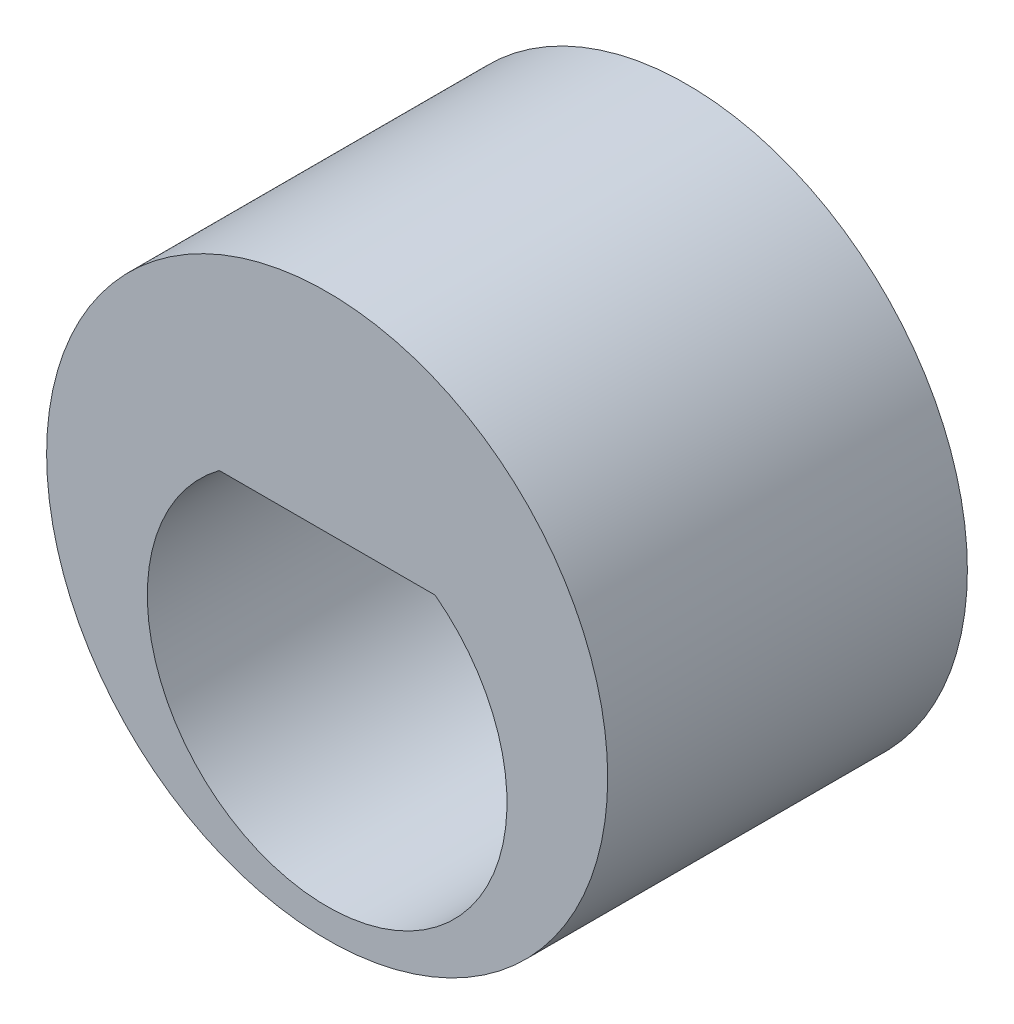
ISO-10303-21;
HEADER;
FILE_DESCRIPTION(('STEP AP214'),'2;1');
FILE_NAME('part.step','',(''),(''),'','','');
FILE_SCHEMA(('AUTOMOTIVE_DESIGN { 1 0 10303 214 1 1 1 1 }'));
ENDSEC;
DATA;
#1=APPLICATION_CONTEXT('core data for automotive mechanical design processes');
#2=APPLICATION_PROTOCOL_DEFINITION('international standard','automotive_design',2000,#1);
#3=PRODUCT_CONTEXT('',#1,'mechanical');
#4=PRODUCT('Part','Part','',(#3));
#5=PRODUCT_RELATED_PRODUCT_CATEGORY('part','',(#4));
#6=PRODUCT_DEFINITION_FORMATION('','',#4);
#7=PRODUCT_DEFINITION_CONTEXT('part definition',#1,'design');
#8=PRODUCT_DEFINITION('design','',#6,#7);
#9=PRODUCT_DEFINITION_SHAPE('','',#8);
#10=(LENGTH_UNIT() NAMED_UNIT(*) SI_UNIT(.MILLI.,.METRE.));
#11=(NAMED_UNIT(*) PLANE_ANGLE_UNIT() SI_UNIT($,.RADIAN.));
#12=(NAMED_UNIT(*) SI_UNIT($,.STERADIAN.) SOLID_ANGLE_UNIT());
#13=UNCERTAINTY_MEASURE_WITH_UNIT(LENGTH_MEASURE(1.E-05),#10,'distance_accuracy_value','');
#14=(GEOMETRIC_REPRESENTATION_CONTEXT(3) GLOBAL_UNCERTAINTY_ASSIGNED_CONTEXT((#13)) GLOBAL_UNIT_ASSIGNED_CONTEXT((#10,
#11,#12)) REPRESENTATION_CONTEXT('',''));
#15=CARTESIAN_POINT('',(0.,0.,0.));
#16=DIRECTION('',(0.,0.,1.));
#17=DIRECTION('',(1.,0.,0.));
#18=AXIS2_PLACEMENT_3D('',#15,#16,#17);
#19=CARTESIAN_POINT('',(0.,0.,5.));
#20=DIRECTION('',(0.,0.,-1.));
#21=DIRECTION('',(-1.,0.,0.));
#22=AXIS2_PLACEMENT_3D('',#19,#20,#21);
#23=CYLINDRICAL_SURFACE('',#22,2.5);
#24=CARTESIAN_POINT('',(0.,0.,0.));
#25=DIRECTION('',(0.,0.,1.));
#26=DIRECTION('',(1.,0.,0.));
#27=AXIS2_PLACEMENT_3D('',#24,#25,#26);
#28=CIRCLE('',#27,2.5);
#29=CARTESIAN_POINT('',(-1.5,2.,0.));
#30=VERTEX_POINT('',#29);
#31=CARTESIAN_POINT('',(1.5,2.,0.));
#32=VERTEX_POINT('',#31);
#33=EDGE_CURVE('E65',#30,#32,#28,.T.);
#34=ORIENTED_EDGE('',*,*,#33,.F.);
#35=DIRECTION('',(0.,0.,-1.));
#36=VECTOR('',#35,1.);
#37=CARTESIAN_POINT('',(-1.5,2.,5.));
#38=LINE('',#37,#36);
#39=CARTESIAN_POINT('',(-1.5,2.,5.));
#40=VERTEX_POINT('',#39);
#41=EDGE_CURVE('E11',#40,#30,#38,.T.);
#42=ORIENTED_EDGE('',*,*,#41,.F.);
#43=CARTESIAN_POINT('',(0.,0.,5.));
#44=DIRECTION('',(0.,0.,1.));
#45=DIRECTION('',(1.,0.,0.));
#46=AXIS2_PLACEMENT_3D('',#43,#44,#45);
#47=CIRCLE('',#46,2.5);
#48=CARTESIAN_POINT('',(1.5,2.,5.));
#49=VERTEX_POINT('',#48);
#50=EDGE_CURVE('E66',#40,#49,#47,.T.);
#51=ORIENTED_EDGE('',*,*,#50,.T.);
#52=DIRECTION('',(0.,0.,-1.));
#53=VECTOR('',#52,1.);
#54=CARTESIAN_POINT('',(1.5,2.,5.));
#55=LINE('',#54,#53);
#56=EDGE_CURVE('E45',#49,#32,#55,.T.);
#57=ORIENTED_EDGE('',*,*,#56,.T.);
#58=EDGE_LOOP('',(#34,#42,#51,#57));
#59=FACE_BOUND('',#58,.T.);
#60=ADVANCED_FACE('F37',(#59),#23,.F.);
#61=CARTESIAN_POINT('',(0.,2.,5.));
#62=DIRECTION('',(0.,1.,0.));
#63=DIRECTION('',(0.,0.,1.));
#64=AXIS2_PLACEMENT_3D('',#61,#62,#63);
#65=PLANE('',#64);
#66=DIRECTION('',(1.,0.,0.));
#67=VECTOR('',#66,1.);
#68=CARTESIAN_POINT('',(0.,2.,0.));
#69=LINE('',#68,#67);
#70=EDGE_CURVE('E68',#30,#32,#69,.T.);
#71=ORIENTED_EDGE('',*,*,#70,.T.);
#72=ORIENTED_EDGE('',*,*,#56,.F.);
#73=DIRECTION('',(1.,0.,0.));
#74=VECTOR('',#73,1.);
#75=CARTESIAN_POINT('',(0.,2.,5.));
#76=LINE('',#75,#74);
#77=EDGE_CURVE('E52',#40,#49,#76,.T.);
#78=ORIENTED_EDGE('',*,*,#77,.F.);
#79=ORIENTED_EDGE('',*,*,#41,.T.);
#80=EDGE_LOOP('',(#71,#72,#78,#79));
#81=FACE_BOUND('',#80,.T.);
#82=ADVANCED_FACE('F69',(#81),#65,.F.);
#83=CARTESIAN_POINT('',(0.,1.,5.));
#84=DIRECTION('',(0.,0.,-1.));
#85=DIRECTION('',(-1.,0.,0.));
#86=AXIS2_PLACEMENT_3D('',#83,#84,#85);
#87=CYLINDRICAL_SURFACE('',#86,3.9);
#88=CARTESIAN_POINT('',(0.,1.,5.));
#89=DIRECTION('',(0.,0.,1.));
#90=DIRECTION('',(1.,0.,0.));
#91=AXIS2_PLACEMENT_3D('',#88,#89,#90);
#92=CIRCLE('',#91,3.9);
#93=CARTESIAN_POINT('',(3.9,1.,5.));
#94=VERTEX_POINT('',#93);
#95=EDGE_CURVE('E67',#94,#94,#92,.T.);
#96=ORIENTED_EDGE('',*,*,#95,.F.);
#97=EDGE_LOOP('',(#96));
#98=FACE_BOUND('',#97,.T.);
#99=CARTESIAN_POINT('',(0.,1.,0.));
#100=DIRECTION('',(0.,0.,1.));
#101=DIRECTION('',(1.,0.,0.));
#102=AXIS2_PLACEMENT_3D('',#99,#100,#101);
#103=CIRCLE('',#102,3.9);
#104=CARTESIAN_POINT('',(3.9,1.,0.));
#105=VERTEX_POINT('',#104);
#106=EDGE_CURVE('E71',#105,#105,#103,.T.);
#107=ORIENTED_EDGE('',*,*,#106,.T.);
#108=EDGE_LOOP('',(#107));
#109=FACE_BOUND('',#108,.T.);
#110=ADVANCED_FACE('F88',(#98,#109),#87,.T.);
#111=CARTESIAN_POINT('',(0.,0.,5.));
#112=DIRECTION('',(0.,0.,1.));
#113=DIRECTION('',(1.,0.,0.));
#114=AXIS2_PLACEMENT_3D('',#111,#112,#113);
#115=PLANE('',#114);
#116=ORIENTED_EDGE('',*,*,#50,.F.);
#117=ORIENTED_EDGE('',*,*,#77,.T.);
#118=EDGE_LOOP('',(#116,#117));
#119=FACE_BOUND('',#118,.T.);
#120=ORIENTED_EDGE('',*,*,#95,.T.);
#121=EDGE_LOOP('',(#120));
#122=FACE_BOUND('',#121,.T.);
#123=ADVANCED_FACE('F86',(#119,#122),#115,.T.);
#124=CARTESIAN_POINT('',(0.,0.,0.));
#125=DIRECTION('',(0.,0.,1.));
#126=DIRECTION('',(1.,0.,0.));
#127=AXIS2_PLACEMENT_3D('',#124,#125,#126);
#128=PLANE('',#127);
#129=ORIENTED_EDGE('',*,*,#33,.T.);
#130=ORIENTED_EDGE('',*,*,#70,.F.);
#131=EDGE_LOOP('',(#129,#130));
#132=FACE_BOUND('',#131,.T.);
#133=ORIENTED_EDGE('',*,*,#106,.F.);
#134=EDGE_LOOP('',(#133));
#135=FACE_BOUND('',#134,.T.);
#136=ADVANCED_FACE('F73',(#132,#135),#128,.F.);
#137=CLOSED_SHELL('',(#60,#82,#110,#123,#136));
#138=MANIFOLD_SOLID_BREP('B2',#137);
#139=ADVANCED_BREP_SHAPE_REPRESENTATION('',(#18,#138),#14);
#140=SHAPE_DEFINITION_REPRESENTATION(#9,#139);
ENDSEC;
END-ISO-10303-21;
